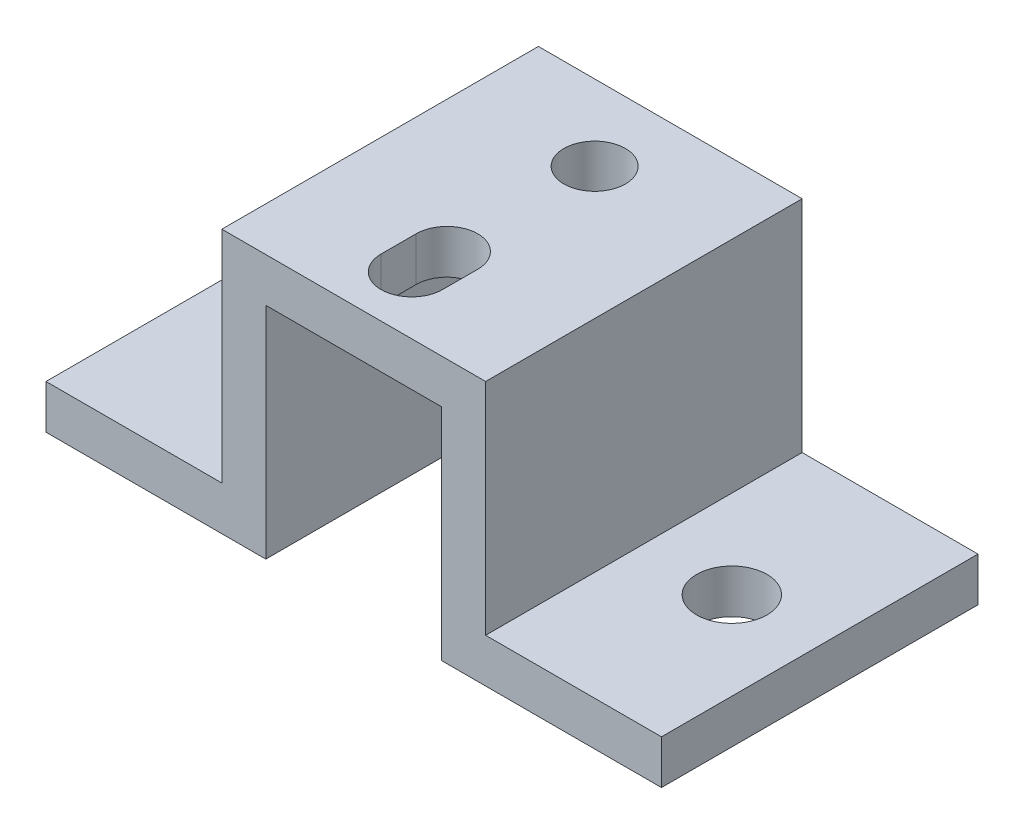
ISO-10303-21;
HEADER;
FILE_DESCRIPTION(('STEP AP214'),'2;1');
FILE_NAME('part.step','',(''),(''),'','','');
FILE_SCHEMA(('AUTOMOTIVE_DESIGN { 1 0 10303 214 1 1 1 1 }'));
ENDSEC;
DATA;
#1=APPLICATION_CONTEXT('core data for automotive mechanical design processes');
#2=APPLICATION_PROTOCOL_DEFINITION('international standard','automotive_design',2000,#1);
#3=PRODUCT_CONTEXT('',#1,'mechanical');
#4=PRODUCT('Part','Part','',(#3));
#5=PRODUCT_RELATED_PRODUCT_CATEGORY('part','',(#4));
#6=PRODUCT_DEFINITION_FORMATION('','',#4);
#7=PRODUCT_DEFINITION_CONTEXT('part definition',#1,'design');
#8=PRODUCT_DEFINITION('design','',#6,#7);
#9=PRODUCT_DEFINITION_SHAPE('','',#8);
#10=(LENGTH_UNIT() NAMED_UNIT(*) SI_UNIT(.MILLI.,.METRE.));
#11=(NAMED_UNIT(*) PLANE_ANGLE_UNIT() SI_UNIT($,.RADIAN.));
#12=(NAMED_UNIT(*) SI_UNIT($,.STERADIAN.) SOLID_ANGLE_UNIT());
#13=UNCERTAINTY_MEASURE_WITH_UNIT(LENGTH_MEASURE(1.E-05),#10,'distance_accuracy_value','');
#14=(GEOMETRIC_REPRESENTATION_CONTEXT(3) GLOBAL_UNCERTAINTY_ASSIGNED_CONTEXT((#13)) GLOBAL_UNIT_ASSIGNED_CONTEXT((#10,
#11,#12)) REPRESENTATION_CONTEXT('',''));
#15=CARTESIAN_POINT('',(0.,0.,0.));
#16=DIRECTION('',(0.,0.,1.));
#17=DIRECTION('',(1.,0.,0.));
#18=AXIS2_PLACEMENT_3D('',#15,#16,#17);
#19=CARTESIAN_POINT('',(-35.,-2.5,18.));
#20=DIRECTION('',(1.,0.,0.));
#21=DIRECTION('',(0.,0.,-1.));
#22=AXIS2_PLACEMENT_3D('',#19,#20,#21);
#23=PLANE('',#22);
#24=DIRECTION('',(0.,-1.,0.));
#25=VECTOR('',#24,1.);
#26=CARTESIAN_POINT('',(-35.,-2.5,0.));
#27=LINE('',#26,#25);
#28=CARTESIAN_POINT('',(-35.,0.,0.));
#29=VERTEX_POINT('',#28);
#30=CARTESIAN_POINT('',(-35.,-2.5,0.));
#31=VERTEX_POINT('',#30);
#32=EDGE_CURVE('E191',#29,#31,#27,.T.);
#33=ORIENTED_EDGE('',*,*,#32,.T.);
#34=DIRECTION('',(0.,0.,-1.));
#35=VECTOR('',#34,1.);
#36=CARTESIAN_POINT('',(-35.,-2.5,18.));
#37=LINE('',#36,#35);
#38=CARTESIAN_POINT('',(-35.,-2.5,18.));
#39=VERTEX_POINT('',#38);
#40=EDGE_CURVE('E11',#39,#31,#37,.T.);
#41=ORIENTED_EDGE('',*,*,#40,.F.);
#42=DIRECTION('',(0.,-1.,0.));
#43=VECTOR('',#42,1.);
#44=CARTESIAN_POINT('',(-35.,-2.5,18.));
#45=LINE('',#44,#43);
#46=CARTESIAN_POINT('',(-35.,0.,18.));
#47=VERTEX_POINT('',#46);
#48=EDGE_CURVE('E192',#47,#39,#45,.T.);
#49=ORIENTED_EDGE('',*,*,#48,.F.);
#50=DIRECTION('',(0.,0.,-1.));
#51=VECTOR('',#50,1.);
#52=CARTESIAN_POINT('',(-35.,0.,18.));
#53=LINE('',#52,#51);
#54=EDGE_CURVE('E218',#47,#29,#53,.T.);
#55=ORIENTED_EDGE('',*,*,#54,.T.);
#56=EDGE_LOOP('',(#33,#41,#49,#55));
#57=FACE_BOUND('',#56,.T.);
#58=ADVANCED_FACE('F33',(#57),#23,.F.);
#59=CARTESIAN_POINT('',(-35.,-2.5,18.));
#60=DIRECTION('',(0.,1.,0.));
#61=DIRECTION('',(0.,0.,1.));
#62=AXIS2_PLACEMENT_3D('',#59,#60,#61);
#63=PLANE('',#62);
#64=CARTESIAN_POINT('',(-30.,-2.5,9.));
#65=DIRECTION('',(0.,1.,0.));
#66=DIRECTION('',(0.,0.,1.));
#67=AXIS2_PLACEMENT_3D('',#64,#65,#66);
#68=CIRCLE('',#67,2.);
#69=CARTESIAN_POINT('',(-30.,-2.5,11.));
#70=VERTEX_POINT('',#69);
#71=EDGE_CURVE('E404',#70,#70,#68,.T.);
#72=ORIENTED_EDGE('',*,*,#71,.T.);
#73=EDGE_LOOP('',(#72));
#74=FACE_BOUND('',#73,.T.);
#75=DIRECTION('',(1.,0.,0.));
#76=VECTOR('',#75,1.);
#77=CARTESIAN_POINT('',(-35.,-2.5,0.));
#78=LINE('',#77,#76);
#79=CARTESIAN_POINT('',(-22.5,-2.5,0.));
#80=VERTEX_POINT('',#79);
#81=EDGE_CURVE('E221',#31,#80,#78,.T.);
#82=ORIENTED_EDGE('',*,*,#81,.T.);
#83=DIRECTION('',(0.,0.,-1.));
#84=VECTOR('',#83,1.);
#85=CARTESIAN_POINT('',(-22.5,-2.5,18.));
#86=LINE('',#85,#84);
#87=CARTESIAN_POINT('',(-22.5,-2.5,18.));
#88=VERTEX_POINT('',#87);
#89=EDGE_CURVE('E41',#88,#80,#86,.T.);
#90=ORIENTED_EDGE('',*,*,#89,.F.);
#91=DIRECTION('',(1.,0.,0.));
#92=VECTOR('',#91,1.);
#93=CARTESIAN_POINT('',(-35.,-2.5,18.));
#94=LINE('',#93,#92);
#95=EDGE_CURVE('E195',#39,#88,#94,.T.);
#96=ORIENTED_EDGE('',*,*,#95,.F.);
#97=ORIENTED_EDGE('',*,*,#40,.T.);
#98=EDGE_LOOP('',(#82,#90,#96,#97));
#99=FACE_BOUND('',#98,.T.);
#100=ADVANCED_FACE('F296',(#74,#99),#63,.F.);
#101=CARTESIAN_POINT('',(-22.5,-2.5,18.));
#102=DIRECTION('',(-1.,0.,0.));
#103=DIRECTION('',(0.,-1.,0.));
#104=AXIS2_PLACEMENT_3D('',#101,#102,#103);
#105=PLANE('',#104);
#106=DIRECTION('',(0.,1.,0.));
#107=VECTOR('',#106,1.);
#108=CARTESIAN_POINT('',(-22.5,-2.5,0.));
#109=LINE('',#108,#107);
#110=CARTESIAN_POINT('',(-22.5,10.,0.));
#111=VERTEX_POINT('',#110);
#112=EDGE_CURVE('E223',#80,#111,#109,.T.);
#113=ORIENTED_EDGE('',*,*,#112,.T.);
#114=DIRECTION('',(0.,0.,-1.));
#115=VECTOR('',#114,1.);
#116=CARTESIAN_POINT('',(-22.5,10.,18.));
#117=LINE('',#116,#115);
#118=CARTESIAN_POINT('',(-22.5,10.,18.));
#119=VERTEX_POINT('',#118);
#120=EDGE_CURVE('E268',#119,#111,#117,.T.);
#121=ORIENTED_EDGE('',*,*,#120,.F.);
#122=DIRECTION('',(0.,1.,0.));
#123=VECTOR('',#122,1.);
#124=CARTESIAN_POINT('',(-22.5,-2.5,18.));
#125=LINE('',#124,#123);
#126=EDGE_CURVE('E198',#88,#119,#125,.T.);
#127=ORIENTED_EDGE('',*,*,#126,.F.);
#128=ORIENTED_EDGE('',*,*,#89,.T.);
#129=EDGE_LOOP('',(#113,#121,#127,#128));
#130=FACE_BOUND('',#129,.T.);
#131=ADVANCED_FACE('F301',(#130),#105,.F.);
#132=CARTESIAN_POINT('',(-22.5,10.,18.));
#133=DIRECTION('',(0.,1.,0.));
#134=DIRECTION('',(0.,0.,1.));
#135=AXIS2_PLACEMENT_3D('',#132,#133,#134);
#136=PLANE('',#135);
#137=DIRECTION('',(0.,0.,1.));
#138=VECTOR('',#137,1.);
#139=CARTESIAN_POINT('',(-19.25,10.,18.));
#140=LINE('',#139,#138);
#141=CARTESIAN_POINT('',(-19.25,10.,12.7));
#142=VERTEX_POINT('',#141);
#143=CARTESIAN_POINT('',(-19.25,10.,14.7));
#144=VERTEX_POINT('',#143);
#145=EDGE_CURVE('E179',#142,#144,#140,.T.);
#146=ORIENTED_EDGE('',*,*,#145,.T.);
#147=CARTESIAN_POINT('',(-17.5,10.,14.7));
#148=DIRECTION('',(0.,1.,0.));
#149=DIRECTION('',(0.,0.,1.));
#150=AXIS2_PLACEMENT_3D('',#147,#148,#149);
#151=CIRCLE('',#150,1.75);
#152=CARTESIAN_POINT('',(-15.75,10.,14.7));
#153=VERTEX_POINT('',#152);
#154=EDGE_CURVE('E182',#144,#153,#151,.T.);
#155=ORIENTED_EDGE('',*,*,#154,.T.);
#156=DIRECTION('',(0.,0.,-1.));
#157=VECTOR('',#156,1.);
#158=CARTESIAN_POINT('',(-15.75,10.,18.));
#159=LINE('',#158,#157);
#160=CARTESIAN_POINT('',(-15.75,10.,12.7));
#161=VERTEX_POINT('',#160);
#162=EDGE_CURVE('E176',#153,#161,#159,.T.);
#163=ORIENTED_EDGE('',*,*,#162,.T.);
#164=CARTESIAN_POINT('',(-17.5,10.,12.7));
#165=DIRECTION('',(0.,1.,0.));
#166=DIRECTION('',(0.,0.,1.));
#167=AXIS2_PLACEMENT_3D('',#164,#165,#166);
#168=CIRCLE('',#167,1.75);
#169=EDGE_CURVE('E153',#161,#142,#168,.T.);
#170=ORIENTED_EDGE('',*,*,#169,.T.);
#171=EDGE_LOOP('',(#146,#155,#163,#170));
#172=FACE_BOUND('',#171,.T.);
#173=CARTESIAN_POINT('',(-17.5,10.,4.3));
#174=DIRECTION('',(0.,1.,0.));
#175=DIRECTION('',(0.,0.,1.));
#176=AXIS2_PLACEMENT_3D('',#173,#174,#175);
#177=CIRCLE('',#176,1.75);
#178=CARTESIAN_POINT('',(-17.5,10.,6.05));
#179=VERTEX_POINT('',#178);
#180=EDGE_CURVE('E188',#179,#179,#177,.T.);
#181=ORIENTED_EDGE('',*,*,#180,.T.);
#182=EDGE_LOOP('',(#181));
#183=FACE_BOUND('',#182,.T.);
#184=DIRECTION('',(1.,0.,0.));
#185=VECTOR('',#184,1.);
#186=CARTESIAN_POINT('',(-22.5,10.,0.));
#187=LINE('',#186,#185);
#188=CARTESIAN_POINT('',(-12.5,10.,0.));
#189=VERTEX_POINT('',#188);
#190=EDGE_CURVE('E225',#111,#189,#187,.T.);
#191=ORIENTED_EDGE('',*,*,#190,.T.);
#192=DIRECTION('',(0.,0.,-1.));
#193=VECTOR('',#192,1.);
#194=CARTESIAN_POINT('',(-12.5,10.,18.));
#195=LINE('',#194,#193);
#196=CARTESIAN_POINT('',(-12.5,10.,18.));
#197=VERTEX_POINT('',#196);
#198=EDGE_CURVE('E265',#197,#189,#195,.T.);
#199=ORIENTED_EDGE('',*,*,#198,.F.);
#200=DIRECTION('',(1.,0.,0.));
#201=VECTOR('',#200,1.);
#202=CARTESIAN_POINT('',(-22.5,10.,18.));
#203=LINE('',#202,#201);
#204=EDGE_CURVE('E200',#119,#197,#203,.T.);
#205=ORIENTED_EDGE('',*,*,#204,.F.);
#206=ORIENTED_EDGE('',*,*,#120,.T.);
#207=EDGE_LOOP('',(#191,#199,#205,#206));
#208=FACE_BOUND('',#207,.T.);
#209=ADVANCED_FACE('F353',(#172,#183,#208),#136,.F.);
#210=CARTESIAN_POINT('',(-12.5,10.,18.));
#211=DIRECTION('',(1.,0.,0.));
#212=DIRECTION('',(0.,1.,0.));
#213=AXIS2_PLACEMENT_3D('',#210,#211,#212);
#214=PLANE('',#213);
#215=DIRECTION('',(0.,-1.,0.));
#216=VECTOR('',#215,1.);
#217=CARTESIAN_POINT('',(-12.5,10.,0.));
#218=LINE('',#217,#216);
#219=CARTESIAN_POINT('',(-12.5,-2.5,0.));
#220=VERTEX_POINT('',#219);
#221=EDGE_CURVE('E227',#189,#220,#218,.T.);
#222=ORIENTED_EDGE('',*,*,#221,.T.);
#223=DIRECTION('',(0.,0.,-1.));
#224=VECTOR('',#223,1.);
#225=CARTESIAN_POINT('',(-12.5,-2.5,18.));
#226=LINE('',#225,#224);
#227=CARTESIAN_POINT('',(-12.5,-2.5,18.));
#228=VERTEX_POINT('',#227);
#229=EDGE_CURVE('E262',#228,#220,#226,.T.);
#230=ORIENTED_EDGE('',*,*,#229,.F.);
#231=DIRECTION('',(0.,-1.,0.));
#232=VECTOR('',#231,1.);
#233=CARTESIAN_POINT('',(-12.5,10.,18.));
#234=LINE('',#233,#232);
#235=EDGE_CURVE('E202',#197,#228,#234,.T.);
#236=ORIENTED_EDGE('',*,*,#235,.F.);
#237=ORIENTED_EDGE('',*,*,#198,.T.);
#238=EDGE_LOOP('',(#222,#230,#236,#237));
#239=FACE_BOUND('',#238,.T.);
#240=ADVANCED_FACE('F350',(#239),#214,.F.);
#241=CARTESIAN_POINT('',(-12.5,-2.5,18.));
#242=DIRECTION('',(0.,1.,0.));
#243=DIRECTION('',(0.,0.,1.));
#244=AXIS2_PLACEMENT_3D('',#241,#242,#243);
#245=PLANE('',#244);
#246=CARTESIAN_POINT('',(-5.,-2.5,9.));
#247=DIRECTION('',(0.,1.,0.));
#248=DIRECTION('',(0.,0.,-1.));
#249=AXIS2_PLACEMENT_3D('',#246,#247,#248);
#250=CIRCLE('',#249,2.);
#251=CARTESIAN_POINT('',(-5.,-2.5,7.));
#252=VERTEX_POINT('',#251);
#253=EDGE_CURVE('E401',#252,#252,#250,.T.);
#254=ORIENTED_EDGE('',*,*,#253,.T.);
#255=EDGE_LOOP('',(#254));
#256=FACE_BOUND('',#255,.T.);
#257=DIRECTION('',(1.,0.,0.));
#258=VECTOR('',#257,1.);
#259=CARTESIAN_POINT('',(-12.5,-2.5,0.));
#260=LINE('',#259,#258);
#261=CARTESIAN_POINT('',(0.,-2.5,0.));
#262=VERTEX_POINT('',#261);
#263=EDGE_CURVE('E229',#220,#262,#260,.T.);
#264=ORIENTED_EDGE('',*,*,#263,.T.);
#265=DIRECTION('',(0.,0.,-1.));
#266=VECTOR('',#265,1.);
#267=CARTESIAN_POINT('',(0.,-2.5,18.));
#268=LINE('',#267,#266);
#269=CARTESIAN_POINT('',(0.,-2.5,18.));
#270=VERTEX_POINT('',#269);
#271=EDGE_CURVE('E259',#270,#262,#268,.T.);
#272=ORIENTED_EDGE('',*,*,#271,.F.);
#273=DIRECTION('',(1.,0.,0.));
#274=VECTOR('',#273,1.);
#275=CARTESIAN_POINT('',(-12.5,-2.5,18.));
#276=LINE('',#275,#274);
#277=EDGE_CURVE('E204',#228,#270,#276,.T.);
#278=ORIENTED_EDGE('',*,*,#277,.F.);
#279=ORIENTED_EDGE('',*,*,#229,.T.);
#280=EDGE_LOOP('',(#264,#272,#278,#279));
#281=FACE_BOUND('',#280,.T.);
#282=ADVANCED_FACE('F346',(#256,#281),#245,.F.);
#283=CARTESIAN_POINT('',(0.,0.,18.));
#284=DIRECTION('',(-1.,0.,0.));
#285=DIRECTION('',(0.,0.,1.));
#286=AXIS2_PLACEMENT_3D('',#283,#284,#285);
#287=PLANE('',#286);
#288=DIRECTION('',(0.,1.,0.));
#289=VECTOR('',#288,1.);
#290=CARTESIAN_POINT('',(0.,0.,0.));
#291=LINE('',#290,#289);
#292=CARTESIAN_POINT('',(0.,0.,0.));
#293=VERTEX_POINT('',#292);
#294=EDGE_CURVE('E231',#262,#293,#291,.T.);
#295=ORIENTED_EDGE('',*,*,#294,.T.);
#296=DIRECTION('',(0.,0.,-1.));
#297=VECTOR('',#296,1.);
#298=CARTESIAN_POINT('',(0.,0.,18.));
#299=LINE('',#298,#297);
#300=CARTESIAN_POINT('',(0.,0.,18.));
#301=VERTEX_POINT('',#300);
#302=EDGE_CURVE('E256',#301,#293,#299,.T.);
#303=ORIENTED_EDGE('',*,*,#302,.F.);
#304=DIRECTION('',(0.,1.,0.));
#305=VECTOR('',#304,1.);
#306=CARTESIAN_POINT('',(0.,0.,18.));
#307=LINE('',#306,#305);
#308=EDGE_CURVE('E206',#270,#301,#307,.T.);
#309=ORIENTED_EDGE('',*,*,#308,.F.);
#310=ORIENTED_EDGE('',*,*,#271,.T.);
#311=EDGE_LOOP('',(#295,#303,#309,#310));
#312=FACE_BOUND('',#311,.T.);
#313=ADVANCED_FACE('F341',(#312),#287,.F.);
#314=CARTESIAN_POINT('',(-10.,0.,18.));
#315=DIRECTION('',(0.,-1.,0.));
#316=DIRECTION('',(0.,0.,-1.));
#317=AXIS2_PLACEMENT_3D('',#314,#315,#316);
#318=PLANE('',#317);
#319=CARTESIAN_POINT('',(-5.,0.,9.));
#320=DIRECTION('',(0.,-1.,0.));
#321=DIRECTION('',(0.,0.,-1.));
#322=AXIS2_PLACEMENT_3D('',#319,#320,#321);
#323=CIRCLE('',#322,2.);
#324=CARTESIAN_POINT('',(-5.,0.,7.));
#325=VERTEX_POINT('',#324);
#326=EDGE_CURVE('E36',#325,#325,#323,.T.);
#327=ORIENTED_EDGE('',*,*,#326,.T.);
#328=EDGE_LOOP('',(#327));
#329=FACE_BOUND('',#328,.T.);
#330=DIRECTION('',(-1.,0.,0.));
#331=VECTOR('',#330,1.);
#332=CARTESIAN_POINT('',(-10.,0.,0.));
#333=LINE('',#332,#331);
#334=CARTESIAN_POINT('',(-10.,0.,0.));
#335=VERTEX_POINT('',#334);
#336=EDGE_CURVE('E233',#293,#335,#333,.T.);
#337=ORIENTED_EDGE('',*,*,#336,.T.);
#338=DIRECTION('',(0.,0.,-1.));
#339=VECTOR('',#338,1.);
#340=CARTESIAN_POINT('',(-10.,0.,18.));
#341=LINE('',#340,#339);
#342=CARTESIAN_POINT('',(-10.,0.,18.));
#343=VERTEX_POINT('',#342);
#344=EDGE_CURVE('E253',#343,#335,#341,.T.);
#345=ORIENTED_EDGE('',*,*,#344,.F.);
#346=DIRECTION('',(-1.,0.,0.));
#347=VECTOR('',#346,1.);
#348=CARTESIAN_POINT('',(-10.,0.,18.));
#349=LINE('',#348,#347);
#350=EDGE_CURVE('E208',#301,#343,#349,.T.);
#351=ORIENTED_EDGE('',*,*,#350,.F.);
#352=ORIENTED_EDGE('',*,*,#302,.T.);
#353=EDGE_LOOP('',(#337,#345,#351,#352));
#354=FACE_BOUND('',#353,.T.);
#355=ADVANCED_FACE('F335',(#329,#354),#318,.F.);
#356=CARTESIAN_POINT('',(-10.,12.5,18.));
#357=DIRECTION('',(-1.,0.,0.));
#358=DIRECTION('',(0.,-1.,0.));
#359=AXIS2_PLACEMENT_3D('',#356,#357,#358);
#360=PLANE('',#359);
#361=DIRECTION('',(0.,1.,0.));
#362=VECTOR('',#361,1.);
#363=CARTESIAN_POINT('',(-10.,12.5,0.));
#364=LINE('',#363,#362);
#365=CARTESIAN_POINT('',(-10.,12.5,0.));
#366=VERTEX_POINT('',#365);
#367=EDGE_CURVE('E235',#335,#366,#364,.T.);
#368=ORIENTED_EDGE('',*,*,#367,.T.);
#369=DIRECTION('',(0.,0.,-1.));
#370=VECTOR('',#369,1.);
#371=CARTESIAN_POINT('',(-10.,12.5,18.));
#372=LINE('',#371,#370);
#373=CARTESIAN_POINT('',(-10.,12.5,18.));
#374=VERTEX_POINT('',#373);
#375=EDGE_CURVE('E250',#374,#366,#372,.T.);
#376=ORIENTED_EDGE('',*,*,#375,.F.);
#377=DIRECTION('',(0.,1.,0.));
#378=VECTOR('',#377,1.);
#379=CARTESIAN_POINT('',(-10.,12.5,18.));
#380=LINE('',#379,#378);
#381=EDGE_CURVE('E210',#343,#374,#380,.T.);
#382=ORIENTED_EDGE('',*,*,#381,.F.);
#383=ORIENTED_EDGE('',*,*,#344,.T.);
#384=EDGE_LOOP('',(#368,#376,#382,#383));
#385=FACE_BOUND('',#384,.T.);
#386=ADVANCED_FACE('F331',(#385),#360,.F.);
#387=CARTESIAN_POINT('',(-25.,12.5,18.));
#388=DIRECTION('',(0.,-1.,0.));
#389=DIRECTION('',(1.,0.,0.));
#390=AXIS2_PLACEMENT_3D('',#387,#388,#389);
#391=PLANE('',#390);
#392=DIRECTION('',(0.,0.,-1.));
#393=VECTOR('',#392,1.);
#394=CARTESIAN_POINT('',(-15.75,12.5,14.7));
#395=LINE('',#394,#393);
#396=CARTESIAN_POINT('',(-15.75,12.5,14.7));
#397=VERTEX_POINT('',#396);
#398=CARTESIAN_POINT('',(-15.75,12.5,12.7));
#399=VERTEX_POINT('',#398);
#400=EDGE_CURVE('E159',#397,#399,#395,.T.);
#401=ORIENTED_EDGE('',*,*,#400,.F.);
#402=CARTESIAN_POINT('',(-17.5,12.5,14.7));
#403=DIRECTION('',(0.,1.,0.));
#404=DIRECTION('',(0.,0.,1.));
#405=AXIS2_PLACEMENT_3D('',#402,#403,#404);
#406=CIRCLE('',#405,1.75);
#407=CARTESIAN_POINT('',(-19.25,12.5,14.7));
#408=VERTEX_POINT('',#407);
#409=EDGE_CURVE('E57',#408,#397,#406,.T.);
#410=ORIENTED_EDGE('',*,*,#409,.F.);
#411=DIRECTION('',(0.,0.,1.));
#412=VECTOR('',#411,1.);
#413=CARTESIAN_POINT('',(-19.25,12.5,14.7));
#414=LINE('',#413,#412);
#415=CARTESIAN_POINT('',(-19.25,12.5,12.7));
#416=VERTEX_POINT('',#415);
#417=EDGE_CURVE('E166',#416,#408,#414,.T.);
#418=ORIENTED_EDGE('',*,*,#417,.F.);
#419=CARTESIAN_POINT('',(-17.5,12.5,12.7));
#420=DIRECTION('',(0.,1.,0.));
#421=DIRECTION('',(0.,0.,1.));
#422=AXIS2_PLACEMENT_3D('',#419,#420,#421);
#423=CIRCLE('',#422,1.75);
#424=EDGE_CURVE('E150',#399,#416,#423,.T.);
#425=ORIENTED_EDGE('',*,*,#424,.F.);
#426=EDGE_LOOP('',(#401,#410,#418,#425));
#427=FACE_BOUND('',#426,.T.);
#428=CARTESIAN_POINT('',(-17.5,12.5,4.3));
#429=DIRECTION('',(0.,1.,0.));
#430=DIRECTION('',(0.,0.,1.));
#431=AXIS2_PLACEMENT_3D('',#428,#429,#430);
#432=CIRCLE('',#431,1.75);
#433=CARTESIAN_POINT('',(-17.5,12.5,6.05));
#434=VERTEX_POINT('',#433);
#435=EDGE_CURVE('E185',#434,#434,#432,.T.);
#436=ORIENTED_EDGE('',*,*,#435,.F.);
#437=EDGE_LOOP('',(#436));
#438=FACE_BOUND('',#437,.T.);
#439=DIRECTION('',(-1.,0.,0.));
#440=VECTOR('',#439,1.);
#441=CARTESIAN_POINT('',(-25.,12.5,0.));
#442=LINE('',#441,#440);
#443=CARTESIAN_POINT('',(-25.,12.5,0.));
#444=VERTEX_POINT('',#443);
#445=EDGE_CURVE('E237',#366,#444,#442,.T.);
#446=ORIENTED_EDGE('',*,*,#445,.T.);
#447=DIRECTION('',(0.,0.,-1.));
#448=VECTOR('',#447,1.);
#449=CARTESIAN_POINT('',(-25.,12.5,18.));
#450=LINE('',#449,#448);
#451=CARTESIAN_POINT('',(-25.,12.5,18.));
#452=VERTEX_POINT('',#451);
#453=EDGE_CURVE('E247',#452,#444,#450,.T.);
#454=ORIENTED_EDGE('',*,*,#453,.F.);
#455=DIRECTION('',(-1.,0.,0.));
#456=VECTOR('',#455,1.);
#457=CARTESIAN_POINT('',(-25.,12.5,18.));
#458=LINE('',#457,#456);
#459=EDGE_CURVE('E212',#374,#452,#458,.T.);
#460=ORIENTED_EDGE('',*,*,#459,.F.);
#461=ORIENTED_EDGE('',*,*,#375,.T.);
#462=EDGE_LOOP('',(#446,#454,#460,#461));
#463=FACE_BOUND('',#462,.T.);
#464=ADVANCED_FACE('F163',(#427,#438,#463),#391,.F.);
#465=CARTESIAN_POINT('',(-25.,0.,18.));
#466=DIRECTION('',(1.,0.,0.));
#467=DIRECTION('',(0.,1.,0.));
#468=AXIS2_PLACEMENT_3D('',#465,#466,#467);
#469=PLANE('',#468);
#470=DIRECTION('',(0.,-1.,0.));
#471=VECTOR('',#470,1.);
#472=CARTESIAN_POINT('',(-25.,0.,0.));
#473=LINE('',#472,#471);
#474=CARTESIAN_POINT('',(-25.,0.,0.));
#475=VERTEX_POINT('',#474);
#476=EDGE_CURVE('E239',#444,#475,#473,.T.);
#477=ORIENTED_EDGE('',*,*,#476,.T.);
#478=DIRECTION('',(0.,0.,-1.));
#479=VECTOR('',#478,1.);
#480=CARTESIAN_POINT('',(-25.,0.,18.));
#481=LINE('',#480,#479);
#482=CARTESIAN_POINT('',(-25.,0.,18.));
#483=VERTEX_POINT('',#482);
#484=EDGE_CURVE('E244',#483,#475,#481,.T.);
#485=ORIENTED_EDGE('',*,*,#484,.F.);
#486=DIRECTION('',(0.,-1.,0.));
#487=VECTOR('',#486,1.);
#488=CARTESIAN_POINT('',(-25.,0.,18.));
#489=LINE('',#488,#487);
#490=EDGE_CURVE('E214',#452,#483,#489,.T.);
#491=ORIENTED_EDGE('',*,*,#490,.F.);
#492=ORIENTED_EDGE('',*,*,#453,.T.);
#493=EDGE_LOOP('',(#477,#485,#491,#492));
#494=FACE_BOUND('',#493,.T.);
#495=ADVANCED_FACE('F321',(#494),#469,.F.);
#496=CARTESIAN_POINT('',(-35.,0.,18.));
#497=DIRECTION('',(0.,-1.,0.));
#498=DIRECTION('',(0.,0.,-1.));
#499=AXIS2_PLACEMENT_3D('',#496,#497,#498);
#500=PLANE('',#499);
#501=CARTESIAN_POINT('',(-30.,0.,9.));
#502=DIRECTION('',(0.,-1.,0.));
#503=DIRECTION('',(0.,0.,-1.));
#504=AXIS2_PLACEMENT_3D('',#501,#502,#503);
#505=CIRCLE('',#504,2.);
#506=CARTESIAN_POINT('',(-30.,0.,7.));
#507=VERTEX_POINT('',#506);
#508=EDGE_CURVE('E173',#507,#507,#505,.T.);
#509=ORIENTED_EDGE('',*,*,#508,.T.);
#510=EDGE_LOOP('',(#509));
#511=FACE_BOUND('',#510,.T.);
#512=DIRECTION('',(-1.,0.,0.));
#513=VECTOR('',#512,1.);
#514=CARTESIAN_POINT('',(-35.,0.,0.));
#515=LINE('',#514,#513);
#516=EDGE_CURVE('E196',#475,#29,#515,.T.);
#517=ORIENTED_EDGE('',*,*,#516,.T.);
#518=ORIENTED_EDGE('',*,*,#54,.F.);
#519=DIRECTION('',(-1.,0.,0.));
#520=VECTOR('',#519,1.);
#521=CARTESIAN_POINT('',(-35.,0.,18.));
#522=LINE('',#521,#520);
#523=EDGE_CURVE('E216',#483,#47,#522,.T.);
#524=ORIENTED_EDGE('',*,*,#523,.F.);
#525=ORIENTED_EDGE('',*,*,#484,.T.);
#526=EDGE_LOOP('',(#517,#518,#524,#525));
#527=FACE_BOUND('',#526,.T.);
#528=ADVANCED_FACE('F275',(#511,#527),#500,.F.);
#529=CARTESIAN_POINT('',(0.,0.,18.));
#530=DIRECTION('',(0.,0.,-1.));
#531=DIRECTION('',(-1.,0.,0.));
#532=AXIS2_PLACEMENT_3D('',#529,#530,#531);
#533=PLANE('',#532);
#534=ORIENTED_EDGE('',*,*,#48,.T.);
#535=ORIENTED_EDGE('',*,*,#95,.T.);
#536=ORIENTED_EDGE('',*,*,#126,.T.);
#537=ORIENTED_EDGE('',*,*,#204,.T.);
#538=ORIENTED_EDGE('',*,*,#235,.T.);
#539=ORIENTED_EDGE('',*,*,#277,.T.);
#540=ORIENTED_EDGE('',*,*,#308,.T.);
#541=ORIENTED_EDGE('',*,*,#350,.T.);
#542=ORIENTED_EDGE('',*,*,#381,.T.);
#543=ORIENTED_EDGE('',*,*,#459,.T.);
#544=ORIENTED_EDGE('',*,*,#490,.T.);
#545=ORIENTED_EDGE('',*,*,#523,.T.);
#546=EDGE_LOOP('',(#534,#535,#536,#537,#538,#539,#540,#541,#542,#543,#544,#545));
#547=FACE_BOUND('',#546,.T.);
#548=ADVANCED_FACE('F316',(#547),#533,.F.);
#549=CARTESIAN_POINT('',(0.,0.,0.));
#550=DIRECTION('',(0.,0.,-1.));
#551=DIRECTION('',(-1.,0.,0.));
#552=AXIS2_PLACEMENT_3D('',#549,#550,#551);
#553=PLANE('',#552);
#554=ORIENTED_EDGE('',*,*,#32,.F.);
#555=ORIENTED_EDGE('',*,*,#516,.F.);
#556=ORIENTED_EDGE('',*,*,#476,.F.);
#557=ORIENTED_EDGE('',*,*,#445,.F.);
#558=ORIENTED_EDGE('',*,*,#367,.F.);
#559=ORIENTED_EDGE('',*,*,#336,.F.);
#560=ORIENTED_EDGE('',*,*,#294,.F.);
#561=ORIENTED_EDGE('',*,*,#263,.F.);
#562=ORIENTED_EDGE('',*,*,#221,.F.);
#563=ORIENTED_EDGE('',*,*,#190,.F.);
#564=ORIENTED_EDGE('',*,*,#112,.F.);
#565=ORIENTED_EDGE('',*,*,#81,.F.);
#566=EDGE_LOOP('',(#554,#555,#556,#557,#558,#559,#560,#561,#562,#563,#564,#565));
#567=FACE_BOUND('',#566,.T.);
#568=ADVANCED_FACE('F290',(#567),#553,.T.);
#569=CARTESIAN_POINT('',(-17.5,-2.5,4.3));
#570=DIRECTION('',(0.,1.,0.));
#571=DIRECTION('',(0.,0.,1.));
#572=AXIS2_PLACEMENT_3D('',#569,#570,#571);
#573=CYLINDRICAL_SURFACE('',#572,1.75);
#574=ORIENTED_EDGE('',*,*,#435,.T.);
#575=EDGE_LOOP('',(#574));
#576=FACE_BOUND('',#575,.T.);
#577=ORIENTED_EDGE('',*,*,#180,.F.);
#578=EDGE_LOOP('',(#577));
#579=FACE_BOUND('',#578,.T.);
#580=ADVANCED_FACE('F281',(#576,#579),#573,.F.);
#581=CARTESIAN_POINT('',(-30.,-2.5,9.));
#582=DIRECTION('',(0.,1.,0.));
#583=DIRECTION('',(0.,0.,1.));
#584=AXIS2_PLACEMENT_3D('',#581,#582,#583);
#585=CYLINDRICAL_SURFACE('',#584,2.);
#586=ORIENTED_EDGE('',*,*,#71,.F.);
#587=EDGE_LOOP('',(#586));
#588=FACE_BOUND('',#587,.T.);
#589=ORIENTED_EDGE('',*,*,#508,.F.);
#590=EDGE_LOOP('',(#589));
#591=FACE_BOUND('',#590,.T.);
#592=ADVANCED_FACE('F278',(#588,#591),#585,.F.);
#593=CARTESIAN_POINT('',(-17.5,-2.5,14.7));
#594=DIRECTION('',(0.,1.,0.));
#595=DIRECTION('',(0.,0.,1.));
#596=AXIS2_PLACEMENT_3D('',#593,#594,#595);
#597=CYLINDRICAL_SURFACE('',#596,1.75);
#598=DIRECTION('',(0.,1.,0.));
#599=VECTOR('',#598,1.);
#600=CARTESIAN_POINT('',(-19.25,-2.5,14.7));
#601=LINE('',#600,#599);
#602=EDGE_CURVE('E171',#144,#408,#601,.T.);
#603=ORIENTED_EDGE('',*,*,#602,.T.);
#604=ORIENTED_EDGE('',*,*,#409,.T.);
#605=DIRECTION('',(0.,1.,0.));
#606=VECTOR('',#605,1.);
#607=CARTESIAN_POINT('',(-15.75,-2.5,14.7));
#608=LINE('',#607,#606);
#609=EDGE_CURVE('E156',#153,#397,#608,.T.);
#610=ORIENTED_EDGE('',*,*,#609,.F.);
#611=ORIENTED_EDGE('',*,*,#154,.F.);
#612=EDGE_LOOP('',(#603,#604,#610,#611));
#613=FACE_BOUND('',#612,.T.);
#614=ADVANCED_FACE('F280',(#613),#597,.F.);
#615=CARTESIAN_POINT('',(-19.25,-2.5,14.7));
#616=DIRECTION('',(-1.,0.,0.));
#617=DIRECTION('',(0.,0.,1.));
#618=AXIS2_PLACEMENT_3D('',#615,#616,#617);
#619=PLANE('',#618);
#620=DIRECTION('',(0.,1.,0.));
#621=VECTOR('',#620,1.);
#622=CARTESIAN_POINT('',(-19.25,-2.5,12.7));
#623=LINE('',#622,#621);
#624=EDGE_CURVE('E155',#142,#416,#623,.T.);
#625=ORIENTED_EDGE('',*,*,#624,.T.);
#626=ORIENTED_EDGE('',*,*,#417,.T.);
#627=ORIENTED_EDGE('',*,*,#602,.F.);
#628=ORIENTED_EDGE('',*,*,#145,.F.);
#629=EDGE_LOOP('',(#625,#626,#627,#628));
#630=FACE_BOUND('',#629,.T.);
#631=ADVANCED_FACE('F288',(#630),#619,.F.);
#632=CARTESIAN_POINT('',(-17.5,-2.5,12.7));
#633=DIRECTION('',(0.,1.,0.));
#634=DIRECTION('',(0.,0.,1.));
#635=AXIS2_PLACEMENT_3D('',#632,#633,#634);
#636=CYLINDRICAL_SURFACE('',#635,1.75);
#637=DIRECTION('',(0.,1.,0.));
#638=VECTOR('',#637,1.);
#639=CARTESIAN_POINT('',(-15.75,-2.5,12.7));
#640=LINE('',#639,#638);
#641=EDGE_CURVE('E49',#161,#399,#640,.T.);
#642=ORIENTED_EDGE('',*,*,#641,.T.);
#643=ORIENTED_EDGE('',*,*,#424,.T.);
#644=ORIENTED_EDGE('',*,*,#624,.F.);
#645=ORIENTED_EDGE('',*,*,#169,.F.);
#646=EDGE_LOOP('',(#642,#643,#644,#645));
#647=FACE_BOUND('',#646,.T.);
#648=ADVANCED_FACE('F147',(#647),#636,.F.);
#649=CARTESIAN_POINT('',(-15.75,-2.5,14.7));
#650=DIRECTION('',(1.,0.,0.));
#651=DIRECTION('',(0.,0.,-1.));
#652=AXIS2_PLACEMENT_3D('',#649,#650,#651);
#653=PLANE('',#652);
#654=ORIENTED_EDGE('',*,*,#609,.T.);
#655=ORIENTED_EDGE('',*,*,#400,.T.);
#656=ORIENTED_EDGE('',*,*,#641,.F.);
#657=ORIENTED_EDGE('',*,*,#162,.F.);
#658=EDGE_LOOP('',(#654,#655,#656,#657));
#659=FACE_BOUND('',#658,.T.);
#660=ADVANCED_FACE('F160',(#659),#653,.F.);
#661=CARTESIAN_POINT('',(-5.,-2.5,9.));
#662=DIRECTION('',(0.,1.,0.));
#663=DIRECTION('',(0.,0.,1.));
#664=AXIS2_PLACEMENT_3D('',#661,#662,#663);
#665=CYLINDRICAL_SURFACE('',#664,2.);
#666=ORIENTED_EDGE('',*,*,#253,.F.);
#667=EDGE_LOOP('',(#666));
#668=FACE_BOUND('',#667,.T.);
#669=ORIENTED_EDGE('',*,*,#326,.F.);
#670=EDGE_LOOP('',(#669));
#671=FACE_BOUND('',#670,.T.);
#672=ADVANCED_FACE('F389',(#668,#671),#665,.F.);
#673=CLOSED_SHELL('',(#58,#100,#131,#209,#240,#282,#313,#355,#386,#464,#495,#528,#548,#568,#580,
#592,#614,#631,#648,#660,#672));
#674=MANIFOLD_SOLID_BREP('B2',#673);
#675=ADVANCED_BREP_SHAPE_REPRESENTATION('',(#18,#674),#14);
#676=SHAPE_DEFINITION_REPRESENTATION(#9,#675);
ENDSEC;
END-ISO-10303-21;
